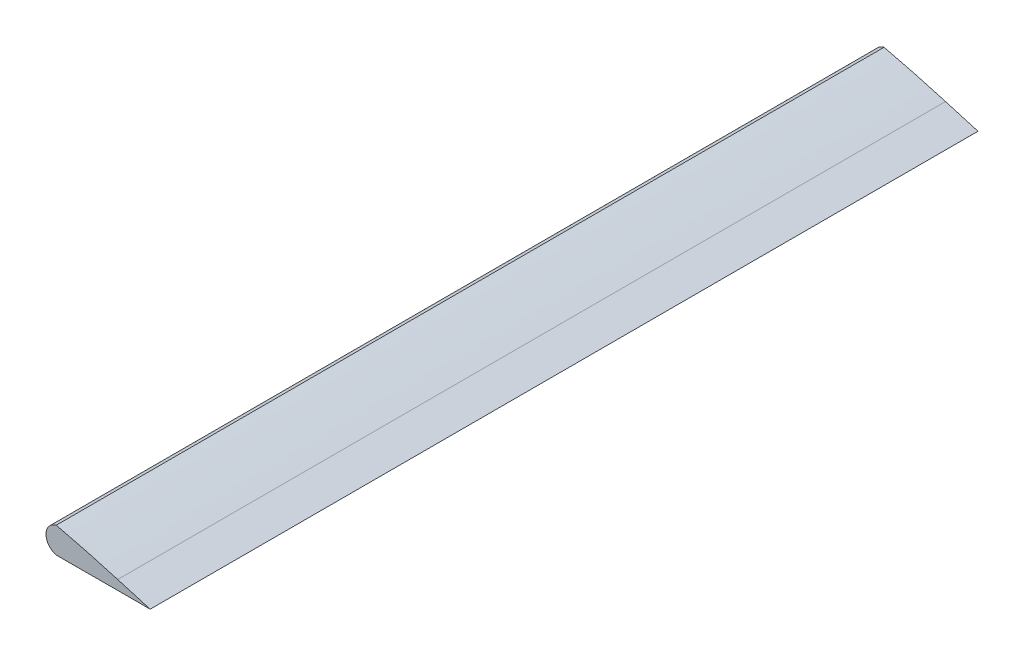
ISO-10303-21;
HEADER;
FILE_DESCRIPTION(('STEP AP214'),'2;1');
FILE_NAME('part.step','',(''),(''),'','','');
FILE_SCHEMA(('AUTOMOTIVE_DESIGN { 1 0 10303 214 1 1 1 1 }'));
ENDSEC;
DATA;
#1=APPLICATION_CONTEXT('core data for automotive mechanical design processes');
#2=APPLICATION_PROTOCOL_DEFINITION('international standard','automotive_design',2000,#1);
#3=PRODUCT_CONTEXT('',#1,'mechanical');
#4=PRODUCT('Part','Part','',(#3));
#5=PRODUCT_RELATED_PRODUCT_CATEGORY('part','',(#4));
#6=PRODUCT_DEFINITION_FORMATION('','',#4);
#7=PRODUCT_DEFINITION_CONTEXT('part definition',#1,'design');
#8=PRODUCT_DEFINITION('design','',#6,#7);
#9=PRODUCT_DEFINITION_SHAPE('','',#8);
#10=(LENGTH_UNIT() NAMED_UNIT(*) SI_UNIT(.MILLI.,.METRE.));
#11=(NAMED_UNIT(*) PLANE_ANGLE_UNIT() SI_UNIT($,.RADIAN.));
#12=(NAMED_UNIT(*) SI_UNIT($,.STERADIAN.) SOLID_ANGLE_UNIT());
#13=UNCERTAINTY_MEASURE_WITH_UNIT(LENGTH_MEASURE(1.E-05),#10,'distance_accuracy_value','');
#14=(GEOMETRIC_REPRESENTATION_CONTEXT(3) GLOBAL_UNCERTAINTY_ASSIGNED_CONTEXT((#13)) GLOBAL_UNIT_ASSIGNED_CONTEXT((#10,
#11,#12)) REPRESENTATION_CONTEXT('',''));
#15=CARTESIAN_POINT('',(0.,0.,0.));
#16=DIRECTION('',(0.,0.,1.));
#17=DIRECTION('',(1.,0.,0.));
#18=AXIS2_PLACEMENT_3D('',#15,#16,#17);
#19=CARTESIAN_POINT('',(208.1996628734,25.9631496413596,249.));
#20=CARTESIAN_POINT('',(205.461210323396,26.7625344787426,249.));
#21=CARTESIAN_POINT('',(203.172469981624,27.4044192230182,249.));
#22=CARTESIAN_POINT('',(200.508776124537,28.1514609118806,249.));
#23=CARTESIAN_POINT('',(198.127071623452,28.7776021409208,249.));
#24=CARTESIAN_POINT('',(193.949594484169,29.8758452979067,249.));
#25=CARTESIAN_POINT('',(189.698329187224,30.8544943366601,249.));
#26=B_SPLINE_CURVE_WITH_KNOTS('',2,(#19,#20,#21,#22,#23,#24,#25),.UNSPECIFIED.,.F.,.F.,(3,2,2,
3),(0.,0.25,0.5,0.915466562821468),.UNSPECIFIED.);
#27=DIRECTION('',(0.,0.,-1.));
#28=VECTOR('',#27,1.);
#29=SURFACE_OF_LINEAR_EXTRUSION('',#26,#28);
#30=CARTESIAN_POINT('',(208.1996628734,25.9631496413596,0.));
#31=CARTESIAN_POINT('',(205.461210323396,26.7625344787426,0.));
#32=CARTESIAN_POINT('',(203.172469981624,27.4044192230182,0.));
#33=CARTESIAN_POINT('',(200.508776124537,28.1514609118806,0.));
#34=CARTESIAN_POINT('',(198.127071623452,28.7776021409208,0.));
#35=CARTESIAN_POINT('',(193.949594484169,29.8758452979067,0.));
#36=CARTESIAN_POINT('',(189.698329187224,30.8544943366601,0.));
#37=B_SPLINE_CURVE_WITH_KNOTS('',2,(#30,#31,#32,#33,#34,#35,#36),.UNSPECIFIED.,.F.,.F.,(3,2,2,
3),(0.,0.25,0.5,0.915466562821468),.UNSPECIFIED.);
#38=CARTESIAN_POINT('',(208.1996628734,25.9631496413596,0.));
#39=VERTEX_POINT('',#38);
#40=CARTESIAN_POINT('',(189.698329187224,30.8544943366601,0.));
#41=VERTEX_POINT('',#40);
#42=EDGE_CURVE('E153',#39,#41,#37,.T.);
#43=ORIENTED_EDGE('',*,*,#42,.T.);
#44=DIRECTION('',(0.,0.,-1.));
#45=VECTOR('',#44,1.);
#46=CARTESIAN_POINT('',(189.698329187224,30.8544943366601,249.));
#47=LINE('',#46,#45);
#48=CARTESIAN_POINT('',(189.698329187224,30.8544943366601,249.));
#49=VERTEX_POINT('',#48);
#50=EDGE_CURVE('E11',#49,#41,#47,.T.);
#51=ORIENTED_EDGE('',*,*,#50,.F.);
#52=CARTESIAN_POINT('',(189.698329187224,30.8544943366601,249.));
#53=CARTESIAN_POINT('',(193.949594484169,29.8758452979067,249.));
#54=CARTESIAN_POINT('',(198.127071623452,28.7776021409208,249.));
#55=CARTESIAN_POINT('',(200.508776124537,28.1514609118806,249.));
#56=CARTESIAN_POINT('',(203.172469981624,27.4044192230182,249.));
#57=CARTESIAN_POINT('',(205.461210323396,26.7625344787426,249.));
#58=CARTESIAN_POINT('',(208.1996628734,25.9631496413596,249.));
#59=B_SPLINE_CURVE_WITH_KNOTS('',2,(#52,#53,#54,#55,#56,#57,#58),.UNSPECIFIED.,.F.,.F.,(3,2,2,
3),(0.,0.415466562821468,0.665466562821468,0.915466562821468),.UNSPECIFIED.);
#60=CARTESIAN_POINT('',(208.1996628734,25.9631496413596,249.));
#61=VERTEX_POINT('',#60);
#62=EDGE_CURVE('E117',#61,#49,#59,.F.);
#63=ORIENTED_EDGE('',*,*,#62,.F.);
#64=DIRECTION('',(0.,0.,-1.));
#65=VECTOR('',#64,1.);
#66=CARTESIAN_POINT('',(208.1996628734,25.9631496413596,249.));
#67=LINE('',#66,#65);
#68=EDGE_CURVE('E107',#61,#39,#67,.T.);
#69=ORIENTED_EDGE('',*,*,#68,.T.);
#70=EDGE_LOOP('',(#43,#51,#63,#69));
#71=FACE_BOUND('',#70,.T.);
#72=ADVANCED_FACE('F33',(#71),#29,.F.);
#73=CARTESIAN_POINT('',(190.626253831565,26.9660707978383,249.));
#74=DIRECTION('',(0.,0.,-1.));
#75=DIRECTION('',(-1.,0.,0.));
#76=AXIS2_PLACEMENT_3D('',#73,#74,#75);
#77=CYLINDRICAL_SURFACE('',#76,3.99760950604731);
#78=CARTESIAN_POINT('',(190.626253831565,26.9660707978383,0.));
#79=DIRECTION('',(0.,0.,1.));
#80=DIRECTION('',(1.,0.,0.));
#81=AXIS2_PLACEMENT_3D('',#78,#79,#80);
#82=CIRCLE('',#81,3.99760950604731);
#83=CARTESIAN_POINT('',(189.698329187379,23.0776472589795,0.));
#84=VERTEX_POINT('',#83);
#85=EDGE_CURVE('E111',#41,#84,#82,.T.);
#86=ORIENTED_EDGE('',*,*,#85,.T.);
#87=DIRECTION('',(0.,0.,-1.));
#88=VECTOR('',#87,1.);
#89=CARTESIAN_POINT('',(189.698329187379,23.0776472589795,249.));
#90=LINE('',#89,#88);
#91=CARTESIAN_POINT('',(189.698329187379,23.0776472589795,249.));
#92=VERTEX_POINT('',#91);
#93=EDGE_CURVE('E44',#92,#84,#90,.T.);
#94=ORIENTED_EDGE('',*,*,#93,.F.);
#95=CARTESIAN_POINT('',(190.626253831565,26.9660707978383,249.));
#96=DIRECTION('',(0.,0.,1.));
#97=DIRECTION('',(1.,0.,0.));
#98=AXIS2_PLACEMENT_3D('',#95,#96,#97);
#99=CIRCLE('',#98,3.99760950604731);
#100=EDGE_CURVE('E87',#49,#92,#99,.T.);
#101=ORIENTED_EDGE('',*,*,#100,.F.);
#102=ORIENTED_EDGE('',*,*,#50,.T.);
#103=EDGE_LOOP('',(#86,#94,#101,#102));
#104=FACE_BOUND('',#103,.T.);
#105=ADVANCED_FACE('F181',(#104),#77,.T.);
#106=CARTESIAN_POINT('',(189.698329187379,23.0776472589795,249.));
#107=DIRECTION('',(-0.00191749962388455,0.999998161595906,0.));
#108=DIRECTION('',(-0.999998161595906,-0.00191749962388455,0.));
#109=AXIS2_PLACEMENT_3D('',#106,#107,#108);
#110=PLANE('',#109);
#111=DIRECTION('',(0.999998161595906,0.00191749962388455,0.));
#112=VECTOR('',#111,1.);
#113=CARTESIAN_POINT('',(189.698329187379,23.0776472589795,0.));
#114=LINE('',#113,#112);
#115=CARTESIAN_POINT('',(207.849600842017,23.1124523795362,0.));
#116=VERTEX_POINT('',#115);
#117=EDGE_CURVE('E102',#84,#116,#114,.T.);
#118=ORIENTED_EDGE('',*,*,#117,.T.);
#119=DIRECTION('',(0.,0.,-1.));
#120=VECTOR('',#119,1.);
#121=CARTESIAN_POINT('',(207.849600842017,23.1124523795362,249.));
#122=LINE('',#121,#120);
#123=CARTESIAN_POINT('',(207.849600842017,23.1124523795362,249.));
#124=VERTEX_POINT('',#123);
#125=EDGE_CURVE('E99',#124,#116,#122,.T.);
#126=ORIENTED_EDGE('',*,*,#125,.F.);
#127=DIRECTION('',(0.999998161595906,0.00191749962388455,0.));
#128=VECTOR('',#127,1.);
#129=CARTESIAN_POINT('',(189.698329187379,23.0776472589795,249.));
#130=LINE('',#129,#128);
#131=EDGE_CURVE('E91',#92,#124,#130,.T.);
#132=ORIENTED_EDGE('',*,*,#131,.F.);
#133=ORIENTED_EDGE('',*,*,#93,.T.);
#134=EDGE_LOOP('',(#118,#126,#132,#133));
#135=FACE_BOUND('',#134,.T.);
#136=ADVANCED_FACE('F100',(#135),#110,.F.);
#137=CARTESIAN_POINT('',(207.849600842017,23.1124523795362,249.));
#138=DIRECTION('',(0.,1.,0.));
#139=DIRECTION('',(-1.,0.,0.));
#140=AXIS2_PLACEMENT_3D('',#137,#138,#139);
#141=PLANE('',#140);
#142=DIRECTION('',(1.,0.,0.));
#143=VECTOR('',#142,1.);
#144=CARTESIAN_POINT('',(207.849600842017,23.1124523795362,0.));
#145=LINE('',#144,#143);
#146=CARTESIAN_POINT('',(217.965296171477,23.1124523795362,0.));
#147=VERTEX_POINT('',#146);
#148=EDGE_CURVE('E73',#116,#147,#145,.T.);
#149=ORIENTED_EDGE('',*,*,#148,.T.);
#150=DIRECTION('',(0.,0.,-1.));
#151=VECTOR('',#150,1.);
#152=CARTESIAN_POINT('',(217.965296171477,23.1124523795362,249.));
#153=LINE('',#152,#151);
#154=CARTESIAN_POINT('',(217.965296171477,23.1124523795362,249.));
#155=VERTEX_POINT('',#154);
#156=EDGE_CURVE('E103',#155,#147,#153,.T.);
#157=ORIENTED_EDGE('',*,*,#156,.F.);
#158=DIRECTION('',(1.,0.,0.));
#159=VECTOR('',#158,1.);
#160=CARTESIAN_POINT('',(207.849600842017,23.1124523795362,249.));
#161=LINE('',#160,#159);
#162=EDGE_CURVE('E95',#124,#155,#161,.T.);
#163=ORIENTED_EDGE('',*,*,#162,.F.);
#164=ORIENTED_EDGE('',*,*,#125,.T.);
#165=EDGE_LOOP('',(#149,#157,#163,#164));
#166=FACE_BOUND('',#165,.T.);
#167=ADVANCED_FACE('F105',(#166),#141,.F.);
#168=CARTESIAN_POINT('',(217.965296171477,23.1124523795362,249.));
#169=DIRECTION('',(-0.280216283266707,-0.959936890942416,0.));
#170=DIRECTION('',(0.959936890942416,-0.280216283266707,0.));
#171=AXIS2_PLACEMENT_3D('',#168,#169,#170);
#172=PLANE('',#171);
#173=DIRECTION('',(-0.959936890942416,0.280216283266707,0.));
#174=VECTOR('',#173,1.);
#175=CARTESIAN_POINT('',(217.965296171477,23.1124523795362,0.));
#176=LINE('',#175,#174);
#177=EDGE_CURVE('E79',#147,#39,#176,.T.);
#178=ORIENTED_EDGE('',*,*,#177,.T.);
#179=ORIENTED_EDGE('',*,*,#68,.F.);
#180=DIRECTION('',(-0.959936890942416,0.280216283266707,0.));
#181=VECTOR('',#180,1.);
#182=CARTESIAN_POINT('',(217.965296171477,23.1124523795362,249.));
#183=LINE('',#182,#181);
#184=EDGE_CURVE('E53',#155,#61,#183,.T.);
#185=ORIENTED_EDGE('',*,*,#184,.F.);
#186=ORIENTED_EDGE('',*,*,#156,.T.);
#187=EDGE_LOOP('',(#178,#179,#185,#186));
#188=FACE_BOUND('',#187,.T.);
#189=ADVANCED_FACE('F133',(#188),#172,.F.);
#190=CARTESIAN_POINT('',(198.940466567947,28.5624268885698,249.));
#191=DIRECTION('',(0.,0.,-1.));
#192=DIRECTION('',(-1.,0.,0.));
#193=AXIS2_PLACEMENT_3D('',#190,#191,#192);
#194=PLANE('',#193);
#195=ORIENTED_EDGE('',*,*,#62,.T.);
#196=ORIENTED_EDGE('',*,*,#100,.T.);
#197=ORIENTED_EDGE('',*,*,#131,.T.);
#198=ORIENTED_EDGE('',*,*,#162,.T.);
#199=ORIENTED_EDGE('',*,*,#184,.T.);
#200=EDGE_LOOP('',(#195,#196,#197,#198,#199));
#201=FACE_BOUND('',#200,.T.);
#202=ADVANCED_FACE('F93',(#201),#194,.F.);
#203=CARTESIAN_POINT('',(198.940466567947,28.5624268885698,0.));
#204=DIRECTION('',(0.,0.,-1.));
#205=DIRECTION('',(-1.,0.,0.));
#206=AXIS2_PLACEMENT_3D('',#203,#204,#205);
#207=PLANE('',#206);
#208=ORIENTED_EDGE('',*,*,#42,.F.);
#209=ORIENTED_EDGE('',*,*,#177,.F.);
#210=ORIENTED_EDGE('',*,*,#148,.F.);
#211=ORIENTED_EDGE('',*,*,#117,.F.);
#212=ORIENTED_EDGE('',*,*,#85,.F.);
#213=EDGE_LOOP('',(#208,#209,#210,#211,#212));
#214=FACE_BOUND('',#213,.T.);
#215=ADVANCED_FACE('F132',(#214),#207,.T.);
#216=CLOSED_SHELL('',(#72,#105,#136,#167,#189,#202,#215));
#217=MANIFOLD_SOLID_BREP('B2',#216);
#218=ADVANCED_BREP_SHAPE_REPRESENTATION('',(#18,#217),#14);
#219=SHAPE_DEFINITION_REPRESENTATION(#9,#218);
ENDSEC;
END-ISO-10303-21;
